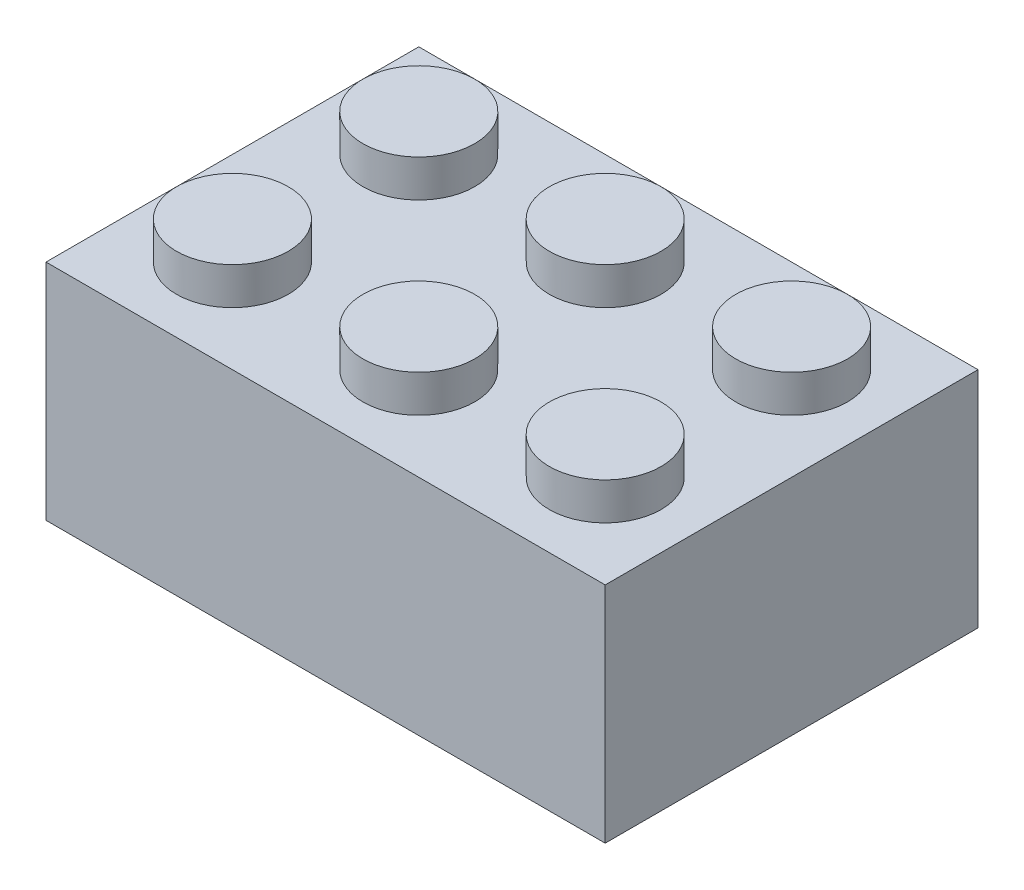
ISO-10303-21;
HEADER;
FILE_DESCRIPTION(('STEP AP214'),'2;1');
FILE_NAME('part.step','',(''),(''),'','','');
FILE_SCHEMA(('AUTOMOTIVE_DESIGN { 1 0 10303 214 1 1 1 1 }'));
ENDSEC;
DATA;
#1=APPLICATION_CONTEXT('core data for automotive mechanical design processes');
#2=APPLICATION_PROTOCOL_DEFINITION('international standard','automotive_design',2000,#1);
#3=PRODUCT_CONTEXT('',#1,'mechanical');
#4=PRODUCT('Part','Part','',(#3));
#5=PRODUCT_RELATED_PRODUCT_CATEGORY('part','',(#4));
#6=PRODUCT_DEFINITION_FORMATION('','',#4);
#7=PRODUCT_DEFINITION_CONTEXT('part definition',#1,'design');
#8=PRODUCT_DEFINITION('design','',#6,#7);
#9=PRODUCT_DEFINITION_SHAPE('','',#8);
#10=(LENGTH_UNIT() NAMED_UNIT(*) SI_UNIT(.MILLI.,.METRE.));
#11=(NAMED_UNIT(*) PLANE_ANGLE_UNIT() SI_UNIT($,.RADIAN.));
#12=(NAMED_UNIT(*) SI_UNIT($,.STERADIAN.) SOLID_ANGLE_UNIT());
#13=UNCERTAINTY_MEASURE_WITH_UNIT(LENGTH_MEASURE(1.E-05),#10,'distance_accuracy_value','');
#14=(GEOMETRIC_REPRESENTATION_CONTEXT(3) GLOBAL_UNCERTAINTY_ASSIGNED_CONTEXT((#13)) GLOBAL_UNIT_ASSIGNED_CONTEXT((#10,
#11,#12)) REPRESENTATION_CONTEXT('',''));
#15=CARTESIAN_POINT('',(0.,0.,0.));
#16=DIRECTION('',(0.,0.,1.));
#17=DIRECTION('',(1.,0.,0.));
#18=AXIS2_PLACEMENT_3D('',#15,#16,#17);
#19=CARTESIAN_POINT('',(20.,4.8,4.));
#20=DIRECTION('',(-1.,0.,0.));
#21=DIRECTION('',(0.,0.,1.));
#22=AXIS2_PLACEMENT_3D('',#19,#20,#21);
#23=PLANE('',#22);
#24=DIRECTION('',(0.,0.,-1.));
#25=VECTOR('',#24,1.);
#26=CARTESIAN_POINT('',(20.,0.,4.));
#27=LINE('',#26,#25);
#28=CARTESIAN_POINT('',(20.,0.,12.));
#29=VERTEX_POINT('',#28);
#30=CARTESIAN_POINT('',(20.,0.,-4.));
#31=VERTEX_POINT('',#30);
#32=EDGE_CURVE('E214',#29,#31,#27,.T.);
#33=ORIENTED_EDGE('',*,*,#32,.T.);
#34=DIRECTION('',(0.,-1.,0.));
#35=VECTOR('',#34,1.);
#36=CARTESIAN_POINT('',(20.,4.8,-4.));
#37=LINE('',#36,#35);
#38=CARTESIAN_POINT('',(20.,9.6,-4.));
#39=VERTEX_POINT('',#38);
#40=EDGE_CURVE('E164',#39,#31,#37,.T.);
#41=ORIENTED_EDGE('',*,*,#40,.F.);
#42=DIRECTION('',(0.,0.,-1.));
#43=VECTOR('',#42,1.);
#44=CARTESIAN_POINT('',(20.,9.6,4.));
#45=LINE('',#44,#43);
#46=CARTESIAN_POINT('',(20.,9.6,12.));
#47=VERTEX_POINT('',#46);
#48=EDGE_CURVE('E11',#47,#39,#45,.T.);
#49=ORIENTED_EDGE('',*,*,#48,.F.);
#50=DIRECTION('',(0.,1.,0.));
#51=VECTOR('',#50,1.);
#52=CARTESIAN_POINT('',(20.,4.8,12.));
#53=LINE('',#52,#51);
#54=EDGE_CURVE('E193',#29,#47,#53,.T.);
#55=ORIENTED_EDGE('',*,*,#54,.F.);
#56=EDGE_LOOP('',(#33,#41,#49,#55));
#57=FACE_BOUND('',#56,.T.);
#58=ADVANCED_FACE('F17',(#57),#23,.F.);
#59=CARTESIAN_POINT('',(8.,9.6,4.));
#60=DIRECTION('',(0.,-1.,0.));
#61=DIRECTION('',(0.,0.,-1.));
#62=AXIS2_PLACEMENT_3D('',#59,#60,#61);
#63=PLANE('',#62);
#64=ORIENTED_EDGE('',*,*,#48,.T.);
#65=DIRECTION('',(1.,0.,0.));
#66=VECTOR('',#65,1.);
#67=CARTESIAN_POINT('',(8.,9.6,-4.));
#68=LINE('',#67,#66);
#69=CARTESIAN_POINT('',(-4.,9.6,-4.));
#70=VERTEX_POINT('',#69);
#71=EDGE_CURVE('E201',#70,#39,#68,.T.);
#72=ORIENTED_EDGE('',*,*,#71,.F.);
#73=DIRECTION('',(0.,0.,-1.));
#74=VECTOR('',#73,1.);
#75=CARTESIAN_POINT('',(-4.,9.6,4.));
#76=LINE('',#75,#74);
#77=CARTESIAN_POINT('',(-4.,9.6,12.));
#78=VERTEX_POINT('',#77);
#79=EDGE_CURVE('E27',#78,#70,#76,.T.);
#80=ORIENTED_EDGE('',*,*,#79,.F.);
#81=DIRECTION('',(-1.,0.,0.));
#82=VECTOR('',#81,1.);
#83=CARTESIAN_POINT('',(8.,9.6,12.));
#84=LINE('',#83,#82);
#85=EDGE_CURVE('E205',#47,#78,#84,.T.);
#86=ORIENTED_EDGE('',*,*,#85,.F.);
#87=EDGE_LOOP('',(#64,#72,#80,#86));
#88=FACE_BOUND('',#87,.T.);
#89=CARTESIAN_POINT('',(0.,9.6,0.));
#90=DIRECTION('',(0.,-1.,0.));
#91=DIRECTION('',(1.,0.,0.));
#92=AXIS2_PLACEMENT_3D('',#89,#90,#91);
#93=CIRCLE('',#92,2.4);
#94=CARTESIAN_POINT('',(-2.4,9.6,0.));
#95=VERTEX_POINT('',#94);
#96=EDGE_CURVE('E190',#95,#95,#93,.T.);
#97=ORIENTED_EDGE('',*,*,#96,.T.);
#98=EDGE_LOOP('',(#97));
#99=FACE_BOUND('',#98,.T.);
#100=CARTESIAN_POINT('',(0.,9.6,8.));
#101=DIRECTION('',(0.,-1.,0.));
#102=DIRECTION('',(1.,0.,0.));
#103=AXIS2_PLACEMENT_3D('',#100,#101,#102);
#104=CIRCLE('',#103,2.4);
#105=CARTESIAN_POINT('',(-2.4,9.6,8.));
#106=VERTEX_POINT('',#105);
#107=EDGE_CURVE('E172',#106,#106,#104,.T.);
#108=ORIENTED_EDGE('',*,*,#107,.T.);
#109=EDGE_LOOP('',(#108));
#110=FACE_BOUND('',#109,.T.);
#111=CARTESIAN_POINT('',(8.,9.6,0.));
#112=DIRECTION('',(0.,-1.,0.));
#113=DIRECTION('',(1.,0.,0.));
#114=AXIS2_PLACEMENT_3D('',#111,#112,#113);
#115=CIRCLE('',#114,2.4);
#116=CARTESIAN_POINT('',(5.6,9.6,0.));
#117=VERTEX_POINT('',#116);
#118=EDGE_CURVE('E148',#117,#117,#115,.T.);
#119=ORIENTED_EDGE('',*,*,#118,.T.);
#120=EDGE_LOOP('',(#119));
#121=FACE_BOUND('',#120,.T.);
#122=CARTESIAN_POINT('',(8.,9.6,8.));
#123=DIRECTION('',(0.,-1.,0.));
#124=DIRECTION('',(1.,0.,0.));
#125=AXIS2_PLACEMENT_3D('',#122,#123,#124);
#126=CIRCLE('',#125,2.4);
#127=CARTESIAN_POINT('',(5.6,9.6,8.));
#128=VERTEX_POINT('',#127);
#129=EDGE_CURVE('E141',#128,#128,#126,.T.);
#130=ORIENTED_EDGE('',*,*,#129,.T.);
#131=EDGE_LOOP('',(#130));
#132=FACE_BOUND('',#131,.T.);
#133=CARTESIAN_POINT('',(16.,9.6,0.));
#134=DIRECTION('',(0.,-1.,0.));
#135=DIRECTION('',(1.,0.,0.));
#136=AXIS2_PLACEMENT_3D('',#133,#134,#135);
#137=CIRCLE('',#136,2.4);
#138=CARTESIAN_POINT('',(13.6,9.6,0.));
#139=VERTEX_POINT('',#138);
#140=EDGE_CURVE('E150',#139,#139,#137,.T.);
#141=ORIENTED_EDGE('',*,*,#140,.T.);
#142=EDGE_LOOP('',(#141));
#143=FACE_BOUND('',#142,.T.);
#144=CARTESIAN_POINT('',(16.,9.6,8.));
#145=DIRECTION('',(0.,-1.,0.));
#146=DIRECTION('',(1.,0.,0.));
#147=AXIS2_PLACEMENT_3D('',#144,#145,#146);
#148=CIRCLE('',#147,2.4);
#149=CARTESIAN_POINT('',(13.6,9.6,8.));
#150=VERTEX_POINT('',#149);
#151=EDGE_CURVE('E115',#150,#150,#148,.T.);
#152=ORIENTED_EDGE('',*,*,#151,.T.);
#153=EDGE_LOOP('',(#152));
#154=FACE_BOUND('',#153,.T.);
#155=ADVANCED_FACE('F142',(#88,#99,#110,#121,#132,#143,#154),#63,.F.);
#156=CARTESIAN_POINT('',(-4.,4.8,4.));
#157=DIRECTION('',(1.,0.,0.));
#158=DIRECTION('',(0.,0.,-1.));
#159=AXIS2_PLACEMENT_3D('',#156,#157,#158);
#160=PLANE('',#159);
#161=ORIENTED_EDGE('',*,*,#79,.T.);
#162=DIRECTION('',(0.,1.,0.));
#163=VECTOR('',#162,1.);
#164=CARTESIAN_POINT('',(-4.,4.8,-4.));
#165=LINE('',#164,#163);
#166=CARTESIAN_POINT('',(-4.,0.,-4.));
#167=VERTEX_POINT('',#166);
#168=EDGE_CURVE('E163',#167,#70,#165,.T.);
#169=ORIENTED_EDGE('',*,*,#168,.F.);
#170=DIRECTION('',(0.,0.,-1.));
#171=VECTOR('',#170,1.);
#172=CARTESIAN_POINT('',(-4.,0.,4.));
#173=LINE('',#172,#171);
#174=CARTESIAN_POINT('',(-4.,0.,12.));
#175=VERTEX_POINT('',#174);
#176=EDGE_CURVE('E555',#175,#167,#173,.T.);
#177=ORIENTED_EDGE('',*,*,#176,.F.);
#178=DIRECTION('',(0.,-1.,0.));
#179=VECTOR('',#178,1.);
#180=CARTESIAN_POINT('',(-4.,4.8,12.));
#181=LINE('',#180,#179);
#182=EDGE_CURVE('E188',#78,#175,#181,.T.);
#183=ORIENTED_EDGE('',*,*,#182,.F.);
#184=EDGE_LOOP('',(#161,#169,#177,#183));
#185=FACE_BOUND('',#184,.T.);
#186=ADVANCED_FACE('F245',(#185),#160,.F.);
#187=CARTESIAN_POINT('',(8.,0.,4.));
#188=DIRECTION('',(0.,1.,0.));
#189=DIRECTION('',(0.,0.,1.));
#190=AXIS2_PLACEMENT_3D('',#187,#188,#189);
#191=PLANE('',#190);
#192=ORIENTED_EDGE('',*,*,#176,.T.);
#193=DIRECTION('',(-1.,0.,0.));
#194=VECTOR('',#193,1.);
#195=CARTESIAN_POINT('',(8.,0.,-4.));
#196=LINE('',#195,#194);
#197=EDGE_CURVE('E160',#31,#167,#196,.T.);
#198=ORIENTED_EDGE('',*,*,#197,.F.);
#199=ORIENTED_EDGE('',*,*,#32,.F.);
#200=DIRECTION('',(1.,0.,0.));
#201=VECTOR('',#200,1.);
#202=CARTESIAN_POINT('',(8.,0.,12.));
#203=LINE('',#202,#201);
#204=EDGE_CURVE('E185',#175,#29,#203,.T.);
#205=ORIENTED_EDGE('',*,*,#204,.F.);
#206=EDGE_LOOP('',(#192,#198,#199,#205));
#207=FACE_BOUND('',#206,.T.);
#208=CARTESIAN_POINT('',(0.,0.,0.));
#209=DIRECTION('',(0.,1.,0.));
#210=DIRECTION('',(1.,0.,0.));
#211=AXIS2_PLACEMENT_3D('',#208,#209,#210);
#212=CIRCLE('',#211,2.4);
#213=CARTESIAN_POINT('',(-2.4,0.,0.));
#214=VERTEX_POINT('',#213);
#215=EDGE_CURVE('E158',#214,#214,#212,.T.);
#216=ORIENTED_EDGE('',*,*,#215,.T.);
#217=EDGE_LOOP('',(#216));
#218=FACE_BOUND('',#217,.T.);
#219=CARTESIAN_POINT('',(0.,0.,8.));
#220=DIRECTION('',(0.,1.,0.));
#221=DIRECTION('',(1.,0.,0.));
#222=AXIS2_PLACEMENT_3D('',#219,#220,#221);
#223=CIRCLE('',#222,2.4);
#224=CARTESIAN_POINT('',(-2.4,0.,8.));
#225=VERTEX_POINT('',#224);
#226=EDGE_CURVE('E159',#225,#225,#223,.T.);
#227=ORIENTED_EDGE('',*,*,#226,.T.);
#228=EDGE_LOOP('',(#227));
#229=FACE_BOUND('',#228,.T.);
#230=CARTESIAN_POINT('',(8.,0.,0.));
#231=DIRECTION('',(0.,1.,0.));
#232=DIRECTION('',(1.,0.,0.));
#233=AXIS2_PLACEMENT_3D('',#230,#231,#232);
#234=CIRCLE('',#233,2.4);
#235=CARTESIAN_POINT('',(5.6,0.,0.));
#236=VERTEX_POINT('',#235);
#237=EDGE_CURVE('E153',#236,#236,#234,.T.);
#238=ORIENTED_EDGE('',*,*,#237,.T.);
#239=EDGE_LOOP('',(#238));
#240=FACE_BOUND('',#239,.T.);
#241=CARTESIAN_POINT('',(8.,0.,8.));
#242=DIRECTION('',(0.,1.,0.));
#243=DIRECTION('',(1.,0.,0.));
#244=AXIS2_PLACEMENT_3D('',#241,#242,#243);
#245=CIRCLE('',#244,2.4);
#246=CARTESIAN_POINT('',(5.6,0.,8.));
#247=VERTEX_POINT('',#246);
#248=EDGE_CURVE('E184',#247,#247,#245,.T.);
#249=ORIENTED_EDGE('',*,*,#248,.T.);
#250=EDGE_LOOP('',(#249));
#251=FACE_BOUND('',#250,.T.);
#252=CARTESIAN_POINT('',(16.,0.,0.));
#253=DIRECTION('',(0.,1.,0.));
#254=DIRECTION('',(1.,0.,0.));
#255=AXIS2_PLACEMENT_3D('',#252,#253,#254);
#256=CIRCLE('',#255,2.4);
#257=CARTESIAN_POINT('',(13.6,0.,0.));
#258=VERTEX_POINT('',#257);
#259=EDGE_CURVE('E174',#258,#258,#256,.T.);
#260=ORIENTED_EDGE('',*,*,#259,.T.);
#261=EDGE_LOOP('',(#260));
#262=FACE_BOUND('',#261,.T.);
#263=CARTESIAN_POINT('',(16.,0.,8.));
#264=DIRECTION('',(0.,1.,0.));
#265=DIRECTION('',(1.,0.,0.));
#266=AXIS2_PLACEMENT_3D('',#263,#264,#265);
#267=CIRCLE('',#266,2.4);
#268=CARTESIAN_POINT('',(13.6,0.,8.));
#269=VERTEX_POINT('',#268);
#270=EDGE_CURVE('E175',#269,#269,#267,.T.);
#271=ORIENTED_EDGE('',*,*,#270,.T.);
#272=EDGE_LOOP('',(#271));
#273=FACE_BOUND('',#272,.T.);
#274=CARTESIAN_POINT('',(4.,0.,4.));
#275=DIRECTION('',(0.,1.,0.));
#276=DIRECTION('',(1.,0.,0.));
#277=AXIS2_PLACEMENT_3D('',#274,#275,#276);
#278=CIRCLE('',#277,2.4);
#279=CARTESIAN_POINT('',(1.6,0.,4.));
#280=VERTEX_POINT('',#279);
#281=EDGE_CURVE('E179',#280,#280,#278,.T.);
#282=ORIENTED_EDGE('',*,*,#281,.T.);
#283=EDGE_LOOP('',(#282));
#284=FACE_BOUND('',#283,.T.);
#285=CARTESIAN_POINT('',(12.,0.,4.));
#286=DIRECTION('',(0.,1.,0.));
#287=DIRECTION('',(1.,0.,0.));
#288=AXIS2_PLACEMENT_3D('',#285,#286,#287);
#289=CIRCLE('',#288,2.4);
#290=CARTESIAN_POINT('',(9.6,0.,4.));
#291=VERTEX_POINT('',#290);
#292=EDGE_CURVE('E195',#291,#291,#289,.T.);
#293=ORIENTED_EDGE('',*,*,#292,.T.);
#294=EDGE_LOOP('',(#293));
#295=FACE_BOUND('',#294,.T.);
#296=ADVANCED_FACE('F218',(#207,#218,#229,#240,#251,#262,#273,#284,#295),#191,.F.);
#297=CARTESIAN_POINT('',(8.,4.8,-4.));
#298=DIRECTION('',(0.,0.,1.));
#299=DIRECTION('',(1.,0.,0.));
#300=AXIS2_PLACEMENT_3D('',#297,#298,#299);
#301=PLANE('',#300);
#302=ORIENTED_EDGE('',*,*,#40,.T.);
#303=ORIENTED_EDGE('',*,*,#197,.T.);
#304=ORIENTED_EDGE('',*,*,#168,.T.);
#305=ORIENTED_EDGE('',*,*,#71,.T.);
#306=EDGE_LOOP('',(#302,#303,#304,#305));
#307=FACE_BOUND('',#306,.T.);
#308=ADVANCED_FACE('F265',(#307),#301,.F.);
#309=CARTESIAN_POINT('',(8.,4.8,12.));
#310=DIRECTION('',(0.,0.,1.));
#311=DIRECTION('',(1.,0.,0.));
#312=AXIS2_PLACEMENT_3D('',#309,#310,#311);
#313=PLANE('',#312);
#314=ORIENTED_EDGE('',*,*,#54,.T.);
#315=ORIENTED_EDGE('',*,*,#85,.T.);
#316=ORIENTED_EDGE('',*,*,#182,.T.);
#317=ORIENTED_EDGE('',*,*,#204,.T.);
#318=EDGE_LOOP('',(#314,#315,#316,#317));
#319=FACE_BOUND('',#318,.T.);
#320=ADVANCED_FACE('F268',(#319),#313,.T.);
#321=CARTESIAN_POINT('',(0.,11.2,0.));
#322=DIRECTION('',(0.,1.,0.));
#323=DIRECTION('',(1.,0.,0.));
#324=AXIS2_PLACEMENT_3D('',#321,#322,#323);
#325=PLANE('',#324);
#326=CARTESIAN_POINT('',(0.,11.2,0.));
#327=DIRECTION('',(0.,1.,0.));
#328=DIRECTION('',(1.,0.,0.));
#329=AXIS2_PLACEMENT_3D('',#326,#327,#328);
#330=CIRCLE('',#329,2.4);
#331=CARTESIAN_POINT('',(2.4,11.2,0.));
#332=VERTEX_POINT('',#331);
#333=EDGE_CURVE('E194',#332,#332,#330,.T.);
#334=ORIENTED_EDGE('',*,*,#333,.T.);
#335=EDGE_LOOP('',(#334));
#336=FACE_BOUND('',#335,.T.);
#337=ADVANCED_FACE('F304',(#336),#325,.T.);
#338=CARTESIAN_POINT('',(0.,10.15,0.));
#339=DIRECTION('',(0.,-1.,0.));
#340=DIRECTION('',(1.,0.,0.));
#341=AXIS2_PLACEMENT_3D('',#338,#339,#340);
#342=CYLINDRICAL_SURFACE('',#341,2.4);
#343=ORIENTED_EDGE('',*,*,#96,.F.);
#344=EDGE_LOOP('',(#343));
#345=FACE_BOUND('',#344,.T.);
#346=ORIENTED_EDGE('',*,*,#333,.F.);
#347=EDGE_LOOP('',(#346));
#348=FACE_BOUND('',#347,.T.);
#349=ADVANCED_FACE('F297',(#345,#348),#342,.T.);
#350=CARTESIAN_POINT('',(0.,11.2,8.));
#351=DIRECTION('',(0.,1.,0.));
#352=DIRECTION('',(1.,0.,0.));
#353=AXIS2_PLACEMENT_3D('',#350,#351,#352);
#354=PLANE('',#353);
#355=CARTESIAN_POINT('',(0.,11.2,8.));
#356=DIRECTION('',(0.,1.,0.));
#357=DIRECTION('',(1.,0.,0.));
#358=AXIS2_PLACEMENT_3D('',#355,#356,#357);
#359=CIRCLE('',#358,2.4);
#360=CARTESIAN_POINT('',(2.4,11.2,8.));
#361=VERTEX_POINT('',#360);
#362=EDGE_CURVE('E170',#361,#361,#359,.T.);
#363=ORIENTED_EDGE('',*,*,#362,.T.);
#364=EDGE_LOOP('',(#363));
#365=FACE_BOUND('',#364,.T.);
#366=ADVANCED_FACE('F289',(#365),#354,.T.);
#367=CARTESIAN_POINT('',(0.,10.15,8.));
#368=DIRECTION('',(0.,-1.,0.));
#369=DIRECTION('',(1.,0.,0.));
#370=AXIS2_PLACEMENT_3D('',#367,#368,#369);
#371=CYLINDRICAL_SURFACE('',#370,2.4);
#372=ORIENTED_EDGE('',*,*,#107,.F.);
#373=EDGE_LOOP('',(#372));
#374=FACE_BOUND('',#373,.T.);
#375=ORIENTED_EDGE('',*,*,#362,.F.);
#376=EDGE_LOOP('',(#375));
#377=FACE_BOUND('',#376,.T.);
#378=ADVANCED_FACE('F282',(#374,#377),#371,.T.);
#379=CARTESIAN_POINT('',(8.,11.2,0.));
#380=DIRECTION('',(0.,1.,0.));
#381=DIRECTION('',(1.,0.,0.));
#382=AXIS2_PLACEMENT_3D('',#379,#380,#381);
#383=PLANE('',#382);
#384=CARTESIAN_POINT('',(8.,11.2,0.));
#385=DIRECTION('',(0.,1.,0.));
#386=DIRECTION('',(1.,0.,0.));
#387=AXIS2_PLACEMENT_3D('',#384,#385,#386);
#388=CIRCLE('',#387,2.4);
#389=CARTESIAN_POINT('',(10.4,11.2,0.));
#390=VERTEX_POINT('',#389);
#391=EDGE_CURVE('E145',#390,#390,#388,.T.);
#392=ORIENTED_EDGE('',*,*,#391,.T.);
#393=EDGE_LOOP('',(#392));
#394=FACE_BOUND('',#393,.T.);
#395=ADVANCED_FACE('F280',(#394),#383,.T.);
#396=CARTESIAN_POINT('',(8.,10.15,0.));
#397=DIRECTION('',(0.,-1.,0.));
#398=DIRECTION('',(1.,0.,0.));
#399=AXIS2_PLACEMENT_3D('',#396,#397,#398);
#400=CYLINDRICAL_SURFACE('',#399,2.4);
#401=ORIENTED_EDGE('',*,*,#118,.F.);
#402=EDGE_LOOP('',(#401));
#403=FACE_BOUND('',#402,.T.);
#404=ORIENTED_EDGE('',*,*,#391,.F.);
#405=EDGE_LOOP('',(#404));
#406=FACE_BOUND('',#405,.T.);
#407=ADVANCED_FACE('F278',(#403,#406),#400,.T.);
#408=CARTESIAN_POINT('',(8.,11.2,8.));
#409=DIRECTION('',(0.,1.,0.));
#410=DIRECTION('',(1.,0.,0.));
#411=AXIS2_PLACEMENT_3D('',#408,#409,#410);
#412=PLANE('',#411);
#413=CARTESIAN_POINT('',(8.,11.2,8.));
#414=DIRECTION('',(0.,1.,0.));
#415=DIRECTION('',(1.,0.,0.));
#416=AXIS2_PLACEMENT_3D('',#413,#414,#415);
#417=CIRCLE('',#416,2.4);
#418=CARTESIAN_POINT('',(10.4,11.2,8.));
#419=VERTEX_POINT('',#418);
#420=EDGE_CURVE('E146',#419,#419,#417,.T.);
#421=ORIENTED_EDGE('',*,*,#420,.T.);
#422=EDGE_LOOP('',(#421));
#423=FACE_BOUND('',#422,.T.);
#424=ADVANCED_FACE('F274',(#423),#412,.T.);
#425=CARTESIAN_POINT('',(8.,10.15,8.));
#426=DIRECTION('',(0.,-1.,0.));
#427=DIRECTION('',(1.,0.,0.));
#428=AXIS2_PLACEMENT_3D('',#425,#426,#427);
#429=CYLINDRICAL_SURFACE('',#428,2.4);
#430=ORIENTED_EDGE('',*,*,#129,.F.);
#431=EDGE_LOOP('',(#430));
#432=FACE_BOUND('',#431,.T.);
#433=ORIENTED_EDGE('',*,*,#420,.F.);
#434=EDGE_LOOP('',(#433));
#435=FACE_BOUND('',#434,.T.);
#436=ADVANCED_FACE('F277',(#432,#435),#429,.T.);
#437=CARTESIAN_POINT('',(16.,11.2,0.));
#438=DIRECTION('',(0.,1.,0.));
#439=DIRECTION('',(1.,0.,0.));
#440=AXIS2_PLACEMENT_3D('',#437,#438,#439);
#441=PLANE('',#440);
#442=CARTESIAN_POINT('',(16.,11.2,0.));
#443=DIRECTION('',(0.,1.,0.));
#444=DIRECTION('',(1.,0.,0.));
#445=AXIS2_PLACEMENT_3D('',#442,#443,#444);
#446=CIRCLE('',#445,2.4);
#447=CARTESIAN_POINT('',(18.4,11.2,0.));
#448=VERTEX_POINT('',#447);
#449=EDGE_CURVE('E166',#448,#448,#446,.T.);
#450=ORIENTED_EDGE('',*,*,#449,.T.);
#451=EDGE_LOOP('',(#450));
#452=FACE_BOUND('',#451,.T.);
#453=ADVANCED_FACE('F253',(#452),#441,.T.);
#454=CARTESIAN_POINT('',(16.,10.15,0.));
#455=DIRECTION('',(0.,-1.,0.));
#456=DIRECTION('',(1.,0.,0.));
#457=AXIS2_PLACEMENT_3D('',#454,#455,#456);
#458=CYLINDRICAL_SURFACE('',#457,2.4);
#459=ORIENTED_EDGE('',*,*,#140,.F.);
#460=EDGE_LOOP('',(#459));
#461=FACE_BOUND('',#460,.T.);
#462=ORIENTED_EDGE('',*,*,#449,.F.);
#463=EDGE_LOOP('',(#462));
#464=FACE_BOUND('',#463,.T.);
#465=ADVANCED_FACE('F249',(#461,#464),#458,.T.);
#466=CARTESIAN_POINT('',(16.,11.2,8.));
#467=DIRECTION('',(0.,1.,0.));
#468=DIRECTION('',(1.,0.,0.));
#469=AXIS2_PLACEMENT_3D('',#466,#467,#468);
#470=PLANE('',#469);
#471=CARTESIAN_POINT('',(16.,11.2,8.));
#472=DIRECTION('',(0.,1.,0.));
#473=DIRECTION('',(1.,0.,0.));
#474=AXIS2_PLACEMENT_3D('',#471,#472,#473);
#475=CIRCLE('',#474,2.4);
#476=CARTESIAN_POINT('',(18.4,11.2,8.));
#477=VERTEX_POINT('',#476);
#478=EDGE_CURVE('E21',#477,#477,#475,.T.);
#479=ORIENTED_EDGE('',*,*,#478,.T.);
#480=EDGE_LOOP('',(#479));
#481=FACE_BOUND('',#480,.T.);
#482=ADVANCED_FACE('F252',(#481),#470,.T.);
#483=CARTESIAN_POINT('',(16.,10.15,8.));
#484=DIRECTION('',(0.,-1.,0.));
#485=DIRECTION('',(1.,0.,0.));
#486=AXIS2_PLACEMENT_3D('',#483,#484,#485);
#487=CYLINDRICAL_SURFACE('',#486,2.4);
#488=ORIENTED_EDGE('',*,*,#151,.F.);
#489=EDGE_LOOP('',(#488));
#490=FACE_BOUND('',#489,.T.);
#491=ORIENTED_EDGE('',*,*,#478,.F.);
#492=EDGE_LOOP('',(#491));
#493=FACE_BOUND('',#492,.T.);
#494=ADVANCED_FACE('F327',(#490,#493),#487,.T.);
#495=CARTESIAN_POINT('',(0.,1.6,0.));
#496=DIRECTION('',(0.,1.,0.));
#497=DIRECTION('',(1.,0.,0.));
#498=AXIS2_PLACEMENT_3D('',#495,#496,#497);
#499=PLANE('',#498);
#500=CARTESIAN_POINT('',(0.,1.6,0.));
#501=DIRECTION('',(0.,1.,0.));
#502=DIRECTION('',(1.,0.,0.));
#503=AXIS2_PLACEMENT_3D('',#500,#501,#502);
#504=CIRCLE('',#503,2.4);
#505=CARTESIAN_POINT('',(2.4,1.6,0.));
#506=VERTEX_POINT('',#505);
#507=EDGE_CURVE('E168',#506,#506,#504,.T.);
#508=ORIENTED_EDGE('',*,*,#507,.F.);
#509=EDGE_LOOP('',(#508));
#510=FACE_BOUND('',#509,.T.);
#511=ADVANCED_FACE('F19',(#510),#499,.F.);
#512=CARTESIAN_POINT('',(0.,0.55,0.));
#513=DIRECTION('',(0.,-1.,0.));
#514=DIRECTION('',(1.,0.,0.));
#515=AXIS2_PLACEMENT_3D('',#512,#513,#514);
#516=CYLINDRICAL_SURFACE('',#515,2.4);
#517=ORIENTED_EDGE('',*,*,#507,.T.);
#518=EDGE_LOOP('',(#517));
#519=FACE_BOUND('',#518,.T.);
#520=ORIENTED_EDGE('',*,*,#215,.F.);
#521=EDGE_LOOP('',(#520));
#522=FACE_BOUND('',#521,.T.);
#523=ADVANCED_FACE('F343',(#519,#522),#516,.F.);
#524=CARTESIAN_POINT('',(0.,1.6,8.));
#525=DIRECTION('',(0.,1.,0.));
#526=DIRECTION('',(1.,0.,0.));
#527=AXIS2_PLACEMENT_3D('',#524,#525,#526);
#528=PLANE('',#527);
#529=CARTESIAN_POINT('',(0.,1.6,8.));
#530=DIRECTION('',(0.,1.,0.));
#531=DIRECTION('',(1.,0.,0.));
#532=AXIS2_PLACEMENT_3D('',#529,#530,#531);
#533=CIRCLE('',#532,2.4);
#534=CARTESIAN_POINT('',(2.4,1.6,8.));
#535=VERTEX_POINT('',#534);
#536=EDGE_CURVE('E156',#535,#535,#533,.T.);
#537=ORIENTED_EDGE('',*,*,#536,.F.);
#538=EDGE_LOOP('',(#537));
#539=FACE_BOUND('',#538,.T.);
#540=ADVANCED_FACE('F259',(#539),#528,.F.);
#541=CARTESIAN_POINT('',(0.,0.55,8.));
#542=DIRECTION('',(0.,-1.,0.));
#543=DIRECTION('',(1.,0.,0.));
#544=AXIS2_PLACEMENT_3D('',#541,#542,#543);
#545=CYLINDRICAL_SURFACE('',#544,2.4);
#546=ORIENTED_EDGE('',*,*,#536,.T.);
#547=EDGE_LOOP('',(#546));
#548=FACE_BOUND('',#547,.T.);
#549=ORIENTED_EDGE('',*,*,#226,.F.);
#550=EDGE_LOOP('',(#549));
#551=FACE_BOUND('',#550,.T.);
#552=ADVANCED_FACE('F255',(#548,#551),#545,.F.);
#553=CARTESIAN_POINT('',(8.,1.6,0.));
#554=DIRECTION('',(0.,1.,0.));
#555=DIRECTION('',(1.,0.,0.));
#556=AXIS2_PLACEMENT_3D('',#553,#554,#555);
#557=PLANE('',#556);
#558=CARTESIAN_POINT('',(8.,1.6,0.));
#559=DIRECTION('',(0.,1.,0.));
#560=DIRECTION('',(1.,0.,0.));
#561=AXIS2_PLACEMENT_3D('',#558,#559,#560);
#562=CIRCLE('',#561,2.4);
#563=CARTESIAN_POINT('',(10.4,1.6,0.));
#564=VERTEX_POINT('',#563);
#565=EDGE_CURVE('E181',#564,#564,#562,.T.);
#566=ORIENTED_EDGE('',*,*,#565,.F.);
#567=EDGE_LOOP('',(#566));
#568=FACE_BOUND('',#567,.T.);
#569=ADVANCED_FACE('F258',(#568),#557,.F.);
#570=CARTESIAN_POINT('',(8.,0.55,0.));
#571=DIRECTION('',(0.,-1.,0.));
#572=DIRECTION('',(1.,0.,0.));
#573=AXIS2_PLACEMENT_3D('',#570,#571,#572);
#574=CYLINDRICAL_SURFACE('',#573,2.4);
#575=ORIENTED_EDGE('',*,*,#565,.T.);
#576=EDGE_LOOP('',(#575));
#577=FACE_BOUND('',#576,.T.);
#578=ORIENTED_EDGE('',*,*,#237,.F.);
#579=EDGE_LOOP('',(#578));
#580=FACE_BOUND('',#579,.T.);
#581=ADVANCED_FACE('F263',(#577,#580),#574,.F.);
#582=CARTESIAN_POINT('',(8.,1.6,8.));
#583=DIRECTION('',(0.,1.,0.));
#584=DIRECTION('',(1.,0.,0.));
#585=AXIS2_PLACEMENT_3D('',#582,#583,#584);
#586=PLANE('',#585);
#587=CARTESIAN_POINT('',(8.,1.6,8.));
#588=DIRECTION('',(0.,1.,0.));
#589=DIRECTION('',(1.,0.,0.));
#590=AXIS2_PLACEMENT_3D('',#587,#588,#589);
#591=CIRCLE('',#590,2.4);
#592=CARTESIAN_POINT('',(10.4,1.6,8.));
#593=VERTEX_POINT('',#592);
#594=EDGE_CURVE('E548',#593,#593,#591,.T.);
#595=ORIENTED_EDGE('',*,*,#594,.F.);
#596=EDGE_LOOP('',(#595));
#597=FACE_BOUND('',#596,.T.);
#598=ADVANCED_FACE('F320',(#597),#586,.F.);
#599=CARTESIAN_POINT('',(8.,0.55,8.));
#600=DIRECTION('',(0.,-1.,0.));
#601=DIRECTION('',(1.,0.,0.));
#602=AXIS2_PLACEMENT_3D('',#599,#600,#601);
#603=CYLINDRICAL_SURFACE('',#602,2.4);
#604=ORIENTED_EDGE('',*,*,#594,.T.);
#605=EDGE_LOOP('',(#604));
#606=FACE_BOUND('',#605,.T.);
#607=ORIENTED_EDGE('',*,*,#248,.F.);
#608=EDGE_LOOP('',(#607));
#609=FACE_BOUND('',#608,.T.);
#610=ADVANCED_FACE('F318',(#606,#609),#603,.F.);
#611=CARTESIAN_POINT('',(16.,1.6,0.));
#612=DIRECTION('',(0.,1.,0.));
#613=DIRECTION('',(1.,0.,0.));
#614=AXIS2_PLACEMENT_3D('',#611,#612,#613);
#615=PLANE('',#614);
#616=CARTESIAN_POINT('',(16.,1.6,0.));
#617=DIRECTION('',(0.,1.,0.));
#618=DIRECTION('',(1.,0.,0.));
#619=AXIS2_PLACEMENT_3D('',#616,#617,#618);
#620=CIRCLE('',#619,2.4);
#621=CARTESIAN_POINT('',(18.4,1.6,0.));
#622=VERTEX_POINT('',#621);
#623=EDGE_CURVE('E182',#622,#622,#620,.T.);
#624=ORIENTED_EDGE('',*,*,#623,.F.);
#625=EDGE_LOOP('',(#624));
#626=FACE_BOUND('',#625,.T.);
#627=ADVANCED_FACE('F314',(#626),#615,.F.);
#628=CARTESIAN_POINT('',(16.,0.55,0.));
#629=DIRECTION('',(0.,-1.,0.));
#630=DIRECTION('',(1.,0.,0.));
#631=AXIS2_PLACEMENT_3D('',#628,#629,#630);
#632=CYLINDRICAL_SURFACE('',#631,2.4);
#633=ORIENTED_EDGE('',*,*,#623,.T.);
#634=EDGE_LOOP('',(#633));
#635=FACE_BOUND('',#634,.T.);
#636=ORIENTED_EDGE('',*,*,#259,.F.);
#637=EDGE_LOOP('',(#636));
#638=FACE_BOUND('',#637,.T.);
#639=ADVANCED_FACE('F317',(#635,#638),#632,.F.);
#640=CARTESIAN_POINT('',(16.,1.6,8.));
#641=DIRECTION('',(0.,1.,0.));
#642=DIRECTION('',(1.,0.,0.));
#643=AXIS2_PLACEMENT_3D('',#640,#641,#642);
#644=PLANE('',#643);
#645=CARTESIAN_POINT('',(16.,1.6,8.));
#646=DIRECTION('',(0.,1.,0.));
#647=DIRECTION('',(1.,0.,0.));
#648=AXIS2_PLACEMENT_3D('',#645,#646,#647);
#649=CIRCLE('',#648,2.4);
#650=CARTESIAN_POINT('',(18.4,1.6,8.));
#651=VERTEX_POINT('',#650);
#652=EDGE_CURVE('E173',#651,#651,#649,.T.);
#653=ORIENTED_EDGE('',*,*,#652,.F.);
#654=EDGE_LOOP('',(#653));
#655=FACE_BOUND('',#654,.T.);
#656=ADVANCED_FACE('F272',(#655),#644,.F.);
#657=CARTESIAN_POINT('',(16.,0.55,8.));
#658=DIRECTION('',(0.,-1.,0.));
#659=DIRECTION('',(1.,0.,0.));
#660=AXIS2_PLACEMENT_3D('',#657,#658,#659);
#661=CYLINDRICAL_SURFACE('',#660,2.4);
#662=ORIENTED_EDGE('',*,*,#652,.T.);
#663=EDGE_LOOP('',(#662));
#664=FACE_BOUND('',#663,.T.);
#665=ORIENTED_EDGE('',*,*,#270,.F.);
#666=EDGE_LOOP('',(#665));
#667=FACE_BOUND('',#666,.T.);
#668=ADVANCED_FACE('F235',(#664,#667),#661,.F.);
#669=CARTESIAN_POINT('',(4.,1.6,4.));
#670=DIRECTION('',(0.,1.,0.));
#671=DIRECTION('',(1.,0.,0.));
#672=AXIS2_PLACEMENT_3D('',#669,#670,#671);
#673=PLANE('',#672);
#674=CARTESIAN_POINT('',(4.,1.6,4.));
#675=DIRECTION('',(0.,1.,0.));
#676=DIRECTION('',(1.,0.,0.));
#677=AXIS2_PLACEMENT_3D('',#674,#675,#676);
#678=CIRCLE('',#677,2.4);
#679=CARTESIAN_POINT('',(6.4,1.6,4.));
#680=VERTEX_POINT('',#679);
#681=EDGE_CURVE('E177',#680,#680,#678,.T.);
#682=ORIENTED_EDGE('',*,*,#681,.F.);
#683=EDGE_LOOP('',(#682));
#684=FACE_BOUND('',#683,.T.);
#685=ADVANCED_FACE('F224',(#684),#673,.F.);
#686=CARTESIAN_POINT('',(4.,0.55,4.));
#687=DIRECTION('',(0.,-1.,0.));
#688=DIRECTION('',(1.,0.,0.));
#689=AXIS2_PLACEMENT_3D('',#686,#687,#688);
#690=CYLINDRICAL_SURFACE('',#689,2.4);
#691=ORIENTED_EDGE('',*,*,#681,.T.);
#692=EDGE_LOOP('',(#691));
#693=FACE_BOUND('',#692,.T.);
#694=ORIENTED_EDGE('',*,*,#281,.F.);
#695=EDGE_LOOP('',(#694));
#696=FACE_BOUND('',#695,.T.);
#697=ADVANCED_FACE('F221',(#693,#696),#690,.F.);
#698=CARTESIAN_POINT('',(12.,1.6,4.));
#699=DIRECTION('',(0.,1.,0.));
#700=DIRECTION('',(1.,0.,0.));
#701=AXIS2_PLACEMENT_3D('',#698,#699,#700);
#702=PLANE('',#701);
#703=CARTESIAN_POINT('',(12.,1.6,4.));
#704=DIRECTION('',(0.,1.,0.));
#705=DIRECTION('',(1.,0.,0.));
#706=AXIS2_PLACEMENT_3D('',#703,#704,#705);
#707=CIRCLE('',#706,2.4);
#708=CARTESIAN_POINT('',(14.4,1.6,4.));
#709=VERTEX_POINT('',#708);
#710=EDGE_CURVE('E197',#709,#709,#707,.T.);
#711=ORIENTED_EDGE('',*,*,#710,.F.);
#712=EDGE_LOOP('',(#711));
#713=FACE_BOUND('',#712,.T.);
#714=ADVANCED_FACE('F223',(#713),#702,.F.);
#715=CARTESIAN_POINT('',(12.,0.55,4.));
#716=DIRECTION('',(0.,-1.,0.));
#717=DIRECTION('',(1.,0.,0.));
#718=AXIS2_PLACEMENT_3D('',#715,#716,#717);
#719=CYLINDRICAL_SURFACE('',#718,2.4);
#720=ORIENTED_EDGE('',*,*,#710,.T.);
#721=EDGE_LOOP('',(#720));
#722=FACE_BOUND('',#721,.T.);
#723=ORIENTED_EDGE('',*,*,#292,.F.);
#724=EDGE_LOOP('',(#723));
#725=FACE_BOUND('',#724,.T.);
#726=ADVANCED_FACE('F232',(#722,#725),#719,.F.);
#727=CLOSED_SHELL('',(#58,#155,#186,#296,#308,#320,#337,#349,#366,#378,#395,#407,#424,#436,#453,
#465,#482,#494,#511,#523,#540,#552,#569,#581,#598,#610,#627,#639,#656,#668,#685,#697,#714,#726));
#728=MANIFOLD_SOLID_BREP('B1',#727);
#729=ADVANCED_BREP_SHAPE_REPRESENTATION('',(#18,#728),#14);
#730=SHAPE_DEFINITION_REPRESENTATION(#9,#729);
ENDSEC;
END-ISO-10303-21;
